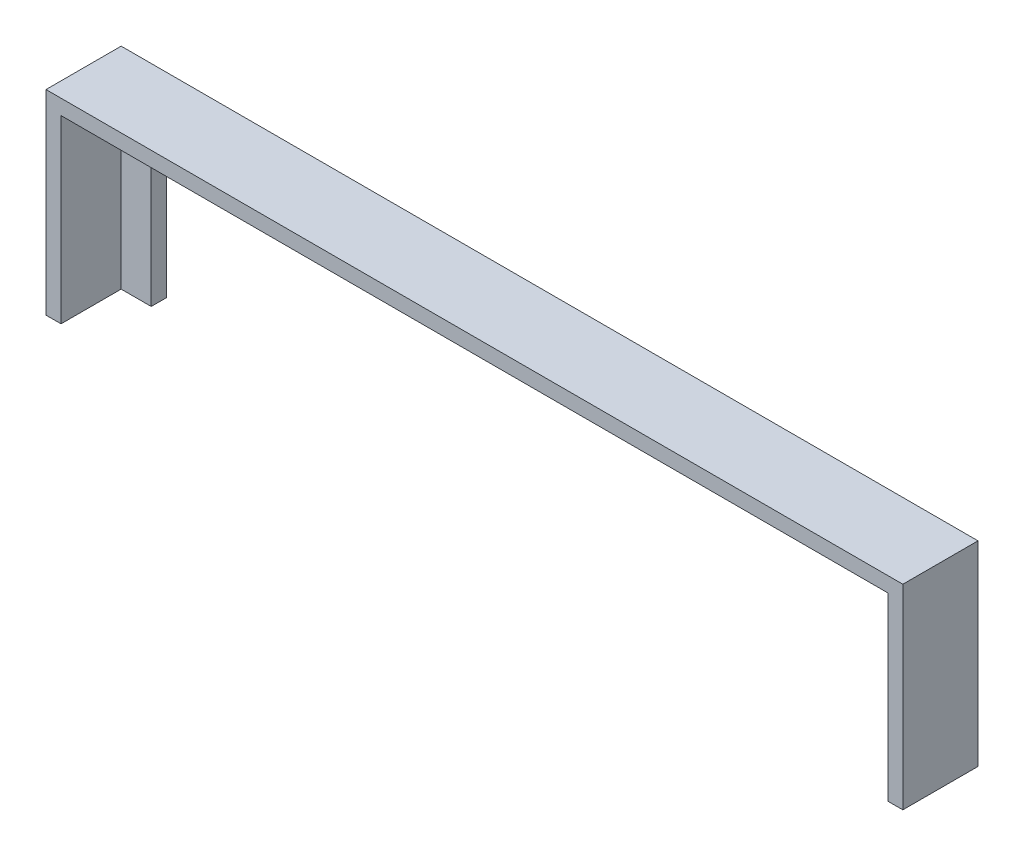
ISO-10303-21;
HEADER;
FILE_DESCRIPTION(('STEP AP214'),'2;1');
FILE_NAME('part.step','',(''),(''),'','','');
FILE_SCHEMA(('AUTOMOTIVE_DESIGN { 1 0 10303 214 1 1 1 1 }'));
ENDSEC;
DATA;
#1=APPLICATION_CONTEXT('core data for automotive mechanical design processes');
#2=APPLICATION_PROTOCOL_DEFINITION('international standard','automotive_design',2000,#1);
#3=PRODUCT_CONTEXT('',#1,'mechanical');
#4=PRODUCT('Part','Part','',(#3));
#5=PRODUCT_RELATED_PRODUCT_CATEGORY('part','',(#4));
#6=PRODUCT_DEFINITION_FORMATION('','',#4);
#7=PRODUCT_DEFINITION_CONTEXT('part definition',#1,'design');
#8=PRODUCT_DEFINITION('design','',#6,#7);
#9=PRODUCT_DEFINITION_SHAPE('','',#8);
#10=(LENGTH_UNIT() NAMED_UNIT(*) SI_UNIT(.MILLI.,.METRE.));
#11=(NAMED_UNIT(*) PLANE_ANGLE_UNIT() SI_UNIT($,.RADIAN.));
#12=(NAMED_UNIT(*) SI_UNIT($,.STERADIAN.) SOLID_ANGLE_UNIT());
#13=UNCERTAINTY_MEASURE_WITH_UNIT(LENGTH_MEASURE(1.E-05),#10,'distance_accuracy_value','');
#14=(GEOMETRIC_REPRESENTATION_CONTEXT(3) GLOBAL_UNCERTAINTY_ASSIGNED_CONTEXT((#13)) GLOBAL_UNIT_ASSIGNED_CONTEXT((#10,
#11,#12)) REPRESENTATION_CONTEXT('',''));
#15=CARTESIAN_POINT('',(0.,0.,0.));
#16=DIRECTION('',(0.,0.,1.));
#17=DIRECTION('',(1.,0.,0.));
#18=AXIS2_PLACEMENT_3D('',#15,#16,#17);
#19=CARTESIAN_POINT('',(-74.8414071478551,-5.70832886252337,5.));
#20=DIRECTION('',(0.,1.,0.));
#21=DIRECTION('',(0.,0.,1.));
#22=AXIS2_PLACEMENT_3D('',#19,#20,#21);
#23=PLANE('',#22);
#24=DIRECTION('',(1.,0.,0.));
#25=VECTOR('',#24,1.);
#26=CARTESIAN_POINT('',(-71.8414071478551,-5.70832886252337,1.));
#27=LINE('',#26,#25);
#28=CARTESIAN_POINT('',(-73.8414071478551,-5.70832886252337,1.));
#29=VERTEX_POINT('',#28);
#30=CARTESIAN_POINT('',(-71.8414071478551,-5.70832886252337,1.));
#31=VERTEX_POINT('',#30);
#32=EDGE_CURVE('E136',#29,#31,#27,.T.);
#33=ORIENTED_EDGE('',*,*,#32,.F.);
#34=DIRECTION('',(0.,0.,1.));
#35=VECTOR('',#34,1.);
#36=CARTESIAN_POINT('',(-73.8414071478551,-5.70832886252337,1.));
#37=LINE('',#36,#35);
#38=CARTESIAN_POINT('',(-73.8414071478551,-5.70832886252337,5.));
#39=VERTEX_POINT('',#38);
#40=EDGE_CURVE('E185',#29,#39,#37,.T.);
#41=ORIENTED_EDGE('',*,*,#40,.T.);
#42=DIRECTION('',(1.,0.,0.));
#43=VECTOR('',#42,1.);
#44=CARTESIAN_POINT('',(-74.8414071478551,-5.70832886252337,5.));
#45=LINE('',#44,#43);
#46=CARTESIAN_POINT('',(-74.8414071478551,-5.70832886252337,5.));
#47=VERTEX_POINT('',#46);
#48=EDGE_CURVE('E169',#47,#39,#45,.T.);
#49=ORIENTED_EDGE('',*,*,#48,.F.);
#50=DIRECTION('',(0.,0.,-1.));
#51=VECTOR('',#50,1.);
#52=CARTESIAN_POINT('',(-74.8414071478551,-5.70832886252337,5.));
#53=LINE('',#52,#51);
#54=CARTESIAN_POINT('',(-74.8414071478551,-5.70832886252337,0.));
#55=VERTEX_POINT('',#54);
#56=EDGE_CURVE('E166',#47,#55,#53,.T.);
#57=ORIENTED_EDGE('',*,*,#56,.T.);
#58=DIRECTION('',(1.,0.,0.));
#59=VECTOR('',#58,1.);
#60=CARTESIAN_POINT('',(-74.8414071478551,-5.70832886252337,0.));
#61=LINE('',#60,#59);
#62=CARTESIAN_POINT('',(-71.8414071478551,-5.70832886252337,0.));
#63=VERTEX_POINT('',#62);
#64=EDGE_CURVE('E182',#55,#63,#61,.T.);
#65=ORIENTED_EDGE('',*,*,#64,.T.);
#66=DIRECTION('',(0.,0.,-1.));
#67=VECTOR('',#66,1.);
#68=CARTESIAN_POINT('',(-71.8414071478551,-5.70832886252337,5.));
#69=LINE('',#68,#67);
#70=EDGE_CURVE('E11',#31,#63,#69,.T.);
#71=ORIENTED_EDGE('',*,*,#70,.F.);
#72=EDGE_LOOP('',(#33,#41,#49,#57,#65,#71));
#73=FACE_BOUND('',#72,.T.);
#74=ADVANCED_FACE('F33',(#73),#23,.F.);
#75=CARTESIAN_POINT('',(-71.8414071478551,-5.70832886252337,5.));
#76=DIRECTION('',(-1.,0.,0.));
#77=DIRECTION('',(0.,0.,1.));
#78=AXIS2_PLACEMENT_3D('',#75,#76,#77);
#79=PLANE('',#78);
#80=DIRECTION('',(0.,0.,-1.));
#81=VECTOR('',#80,1.);
#82=CARTESIAN_POINT('',(-71.8414071478551,4.29167113747663,5.));
#83=LINE('',#82,#81);
#84=CARTESIAN_POINT('',(-71.8414071478551,4.29167113747663,1.));
#85=VERTEX_POINT('',#84);
#86=CARTESIAN_POINT('',(-71.8414071478551,4.29167113747663,0.));
#87=VERTEX_POINT('',#86);
#88=EDGE_CURVE('E40',#85,#87,#83,.T.);
#89=ORIENTED_EDGE('',*,*,#88,.F.);
#90=DIRECTION('',(0.,1.,0.));
#91=VECTOR('',#90,1.);
#92=CARTESIAN_POINT('',(-71.8414071478551,4.29167113747663,1.));
#93=LINE('',#92,#91);
#94=EDGE_CURVE('E129',#31,#85,#93,.T.);
#95=ORIENTED_EDGE('',*,*,#94,.F.);
#96=ORIENTED_EDGE('',*,*,#70,.T.);
#97=DIRECTION('',(0.,1.,0.));
#98=VECTOR('',#97,1.);
#99=CARTESIAN_POINT('',(-71.8414071478551,-5.70832886252337,0.));
#100=LINE('',#99,#98);
#101=EDGE_CURVE('E152',#63,#87,#100,.T.);
#102=ORIENTED_EDGE('',*,*,#101,.T.);
#103=EDGE_LOOP('',(#89,#95,#96,#102));
#104=FACE_BOUND('',#103,.T.);
#105=ADVANCED_FACE('F150',(#104),#79,.F.);
#106=CARTESIAN_POINT('',(-71.8414071478551,4.29167113747663,5.));
#107=DIRECTION('',(0.,1.,0.));
#108=DIRECTION('',(0.,0.,1.));
#109=AXIS2_PLACEMENT_3D('',#106,#107,#108);
#110=PLANE('',#109);
#111=DIRECTION('',(0.,0.,-1.));
#112=VECTOR('',#111,1.);
#113=CARTESIAN_POINT('',(-20.8414071478551,4.29167113747663,5.));
#114=LINE('',#113,#112);
#115=CARTESIAN_POINT('',(-20.8414071478551,4.29167113747663,1.));
#116=VERTEX_POINT('',#115);
#117=CARTESIAN_POINT('',(-20.8414071478551,4.29167113747663,0.));
#118=VERTEX_POINT('',#117);
#119=EDGE_CURVE('E147',#116,#118,#114,.T.);
#120=ORIENTED_EDGE('',*,*,#119,.F.);
#121=DIRECTION('',(1.,0.,0.));
#122=VECTOR('',#121,1.);
#123=CARTESIAN_POINT('',(-20.8414071478551,4.29167113747663,1.));
#124=LINE('',#123,#122);
#125=EDGE_CURVE('E132',#85,#116,#124,.T.);
#126=ORIENTED_EDGE('',*,*,#125,.F.);
#127=ORIENTED_EDGE('',*,*,#88,.T.);
#128=DIRECTION('',(1.,0.,0.));
#129=VECTOR('',#128,1.);
#130=CARTESIAN_POINT('',(-71.8414071478551,4.29167113747663,0.));
#131=LINE('',#130,#129);
#132=EDGE_CURVE('E179',#87,#118,#131,.T.);
#133=ORIENTED_EDGE('',*,*,#132,.T.);
#134=EDGE_LOOP('',(#120,#126,#127,#133));
#135=FACE_BOUND('',#134,.T.);
#136=ADVANCED_FACE('F144',(#135),#110,.F.);
#137=CARTESIAN_POINT('',(-20.8414071478551,4.29167113747663,5.));
#138=DIRECTION('',(1.,0.,0.));
#139=DIRECTION('',(0.,0.,-1.));
#140=AXIS2_PLACEMENT_3D('',#137,#138,#139);
#141=PLANE('',#140);
#142=DIRECTION('',(0.,0.,-1.));
#143=VECTOR('',#142,1.);
#144=CARTESIAN_POINT('',(-20.8414071478551,-5.70832886252337,5.));
#145=LINE('',#144,#143);
#146=CARTESIAN_POINT('',(-20.8414071478551,-5.70832886252337,1.));
#147=VERTEX_POINT('',#146);
#148=CARTESIAN_POINT('',(-20.8414071478551,-5.70832886252337,0.));
#149=VERTEX_POINT('',#148);
#150=EDGE_CURVE('E154',#147,#149,#145,.T.);
#151=ORIENTED_EDGE('',*,*,#150,.F.);
#152=DIRECTION('',(0.,-1.,0.));
#153=VECTOR('',#152,1.);
#154=CARTESIAN_POINT('',(-20.8414071478551,-5.70832886252337,1.));
#155=LINE('',#154,#153);
#156=EDGE_CURVE('E148',#116,#147,#155,.T.);
#157=ORIENTED_EDGE('',*,*,#156,.F.);
#158=ORIENTED_EDGE('',*,*,#119,.T.);
#159=DIRECTION('',(0.,-1.,0.));
#160=VECTOR('',#159,1.);
#161=CARTESIAN_POINT('',(-20.8414071478551,4.29167113747663,0.));
#162=LINE('',#161,#160);
#163=EDGE_CURVE('E176',#118,#149,#162,.T.);
#164=ORIENTED_EDGE('',*,*,#163,.T.);
#165=EDGE_LOOP('',(#151,#157,#158,#164));
#166=FACE_BOUND('',#165,.T.);
#167=ADVANCED_FACE('F223',(#166),#141,.F.);
#168=CARTESIAN_POINT('',(-20.8414071478551,-5.70832886252337,5.));
#169=DIRECTION('',(0.,1.,0.));
#170=DIRECTION('',(0.,0.,1.));
#171=AXIS2_PLACEMENT_3D('',#168,#169,#170);
#172=PLANE('',#171);
#173=DIRECTION('',(1.,0.,0.));
#174=VECTOR('',#173,1.);
#175=CARTESIAN_POINT('',(-20.8414071478551,-5.70832886252337,5.));
#176=LINE('',#175,#174);
#177=CARTESIAN_POINT('',(-18.8414071478551,-5.70832886252337,5.));
#178=VERTEX_POINT('',#177);
#179=CARTESIAN_POINT('',(-17.8414071478551,-5.70832886252337,5.));
#180=VERTEX_POINT('',#179);
#181=EDGE_CURVE('E94',#178,#180,#176,.T.);
#182=ORIENTED_EDGE('',*,*,#181,.F.);
#183=DIRECTION('',(0.,0.,1.));
#184=VECTOR('',#183,1.);
#185=CARTESIAN_POINT('',(-18.8414071478551,-5.70832886252337,1.));
#186=LINE('',#185,#184);
#187=CARTESIAN_POINT('',(-18.8414071478551,-5.70832886252337,1.));
#188=VERTEX_POINT('',#187);
#189=EDGE_CURVE('E47',#188,#178,#186,.T.);
#190=ORIENTED_EDGE('',*,*,#189,.F.);
#191=DIRECTION('',(1.,0.,0.));
#192=VECTOR('',#191,1.);
#193=CARTESIAN_POINT('',(-18.8414071478551,-5.70832886252337,1.));
#194=LINE('',#193,#192);
#195=EDGE_CURVE('E215',#147,#188,#194,.T.);
#196=ORIENTED_EDGE('',*,*,#195,.F.);
#197=ORIENTED_EDGE('',*,*,#150,.T.);
#198=DIRECTION('',(1.,0.,0.));
#199=VECTOR('',#198,1.);
#200=CARTESIAN_POINT('',(-20.8414071478551,-5.70832886252337,0.));
#201=LINE('',#200,#199);
#202=CARTESIAN_POINT('',(-17.8414071478551,-5.70832886252337,0.));
#203=VERTEX_POINT('',#202);
#204=EDGE_CURVE('E174',#149,#203,#201,.T.);
#205=ORIENTED_EDGE('',*,*,#204,.T.);
#206=DIRECTION('',(0.,0.,-1.));
#207=VECTOR('',#206,1.);
#208=CARTESIAN_POINT('',(-17.8414071478551,-5.70832886252337,5.));
#209=LINE('',#208,#207);
#210=EDGE_CURVE('E158',#180,#203,#209,.T.);
#211=ORIENTED_EDGE('',*,*,#210,.F.);
#212=EDGE_LOOP('',(#182,#190,#196,#197,#205,#211));
#213=FACE_BOUND('',#212,.T.);
#214=ADVANCED_FACE('F222',(#213),#172,.F.);
#215=CARTESIAN_POINT('',(-17.8414071478551,-5.70832886252337,5.));
#216=DIRECTION('',(-1.,0.,0.));
#217=DIRECTION('',(0.,0.,1.));
#218=AXIS2_PLACEMENT_3D('',#215,#216,#217);
#219=PLANE('',#218);
#220=DIRECTION('',(0.,1.,0.));
#221=VECTOR('',#220,1.);
#222=CARTESIAN_POINT('',(-17.8414071478551,-5.70832886252337,0.));
#223=LINE('',#222,#221);
#224=CARTESIAN_POINT('',(-17.8414071478551,7.29167113747663,0.));
#225=VERTEX_POINT('',#224);
#226=EDGE_CURVE('E172',#203,#225,#223,.T.);
#227=ORIENTED_EDGE('',*,*,#226,.T.);
#228=DIRECTION('',(0.,0.,-1.));
#229=VECTOR('',#228,1.);
#230=CARTESIAN_POINT('',(-17.8414071478551,7.29167113747663,5.));
#231=LINE('',#230,#229);
#232=CARTESIAN_POINT('',(-17.8414071478551,7.29167113747663,5.));
#233=VERTEX_POINT('',#232);
#234=EDGE_CURVE('E161',#233,#225,#231,.T.);
#235=ORIENTED_EDGE('',*,*,#234,.F.);
#236=DIRECTION('',(0.,1.,0.));
#237=VECTOR('',#236,1.);
#238=CARTESIAN_POINT('',(-17.8414071478551,-5.70832886252337,5.));
#239=LINE('',#238,#237);
#240=EDGE_CURVE('E189',#180,#233,#239,.T.);
#241=ORIENTED_EDGE('',*,*,#240,.F.);
#242=ORIENTED_EDGE('',*,*,#210,.T.);
#243=EDGE_LOOP('',(#227,#235,#241,#242));
#244=FACE_BOUND('',#243,.T.);
#245=ADVANCED_FACE('F233',(#244),#219,.F.);
#246=CARTESIAN_POINT('',(-17.8414071478551,7.29167113747663,5.));
#247=DIRECTION('',(0.,-1.,0.));
#248=DIRECTION('',(1.,0.,0.));
#249=AXIS2_PLACEMENT_3D('',#246,#247,#248);
#250=PLANE('',#249);
#251=DIRECTION('',(-1.,0.,0.));
#252=VECTOR('',#251,1.);
#253=CARTESIAN_POINT('',(-17.8414071478551,7.29167113747663,0.));
#254=LINE('',#253,#252);
#255=CARTESIAN_POINT('',(-74.8414071478551,7.29167113747662,0.));
#256=VERTEX_POINT('',#255);
#257=EDGE_CURVE('E170',#225,#256,#254,.T.);
#258=ORIENTED_EDGE('',*,*,#257,.T.);
#259=DIRECTION('',(0.,0.,-1.));
#260=VECTOR('',#259,1.);
#261=CARTESIAN_POINT('',(-74.8414071478551,7.29167113747662,5.));
#262=LINE('',#261,#260);
#263=CARTESIAN_POINT('',(-74.8414071478551,7.29167113747662,5.));
#264=VERTEX_POINT('',#263);
#265=EDGE_CURVE('E164',#264,#256,#262,.T.);
#266=ORIENTED_EDGE('',*,*,#265,.F.);
#267=DIRECTION('',(-1.,0.,0.));
#268=VECTOR('',#267,1.);
#269=CARTESIAN_POINT('',(-17.8414071478551,7.29167113747663,5.));
#270=LINE('',#269,#268);
#271=EDGE_CURVE('E187',#233,#264,#270,.T.);
#272=ORIENTED_EDGE('',*,*,#271,.F.);
#273=ORIENTED_EDGE('',*,*,#234,.T.);
#274=EDGE_LOOP('',(#258,#266,#272,#273));
#275=FACE_BOUND('',#274,.T.);
#276=ADVANCED_FACE('F240',(#275),#250,.F.);
#277=CARTESIAN_POINT('',(-74.8414071478551,7.29167113747662,5.));
#278=DIRECTION('',(1.,0.,0.));
#279=DIRECTION('',(0.,0.,-1.));
#280=AXIS2_PLACEMENT_3D('',#277,#278,#279);
#281=PLANE('',#280);
#282=DIRECTION('',(0.,-1.,0.));
#283=VECTOR('',#282,1.);
#284=CARTESIAN_POINT('',(-74.8414071478551,7.29167113747662,0.));
#285=LINE('',#284,#283);
#286=EDGE_CURVE('E88',#256,#55,#285,.T.);
#287=ORIENTED_EDGE('',*,*,#286,.T.);
#288=ORIENTED_EDGE('',*,*,#56,.F.);
#289=DIRECTION('',(0.,-1.,0.));
#290=VECTOR('',#289,1.);
#291=CARTESIAN_POINT('',(-74.8414071478551,7.29167113747662,5.));
#292=LINE('',#291,#290);
#293=EDGE_CURVE('E56',#264,#47,#292,.T.);
#294=ORIENTED_EDGE('',*,*,#293,.F.);
#295=ORIENTED_EDGE('',*,*,#265,.T.);
#296=EDGE_LOOP('',(#287,#288,#294,#295));
#297=FACE_BOUND('',#296,.T.);
#298=ADVANCED_FACE('F241',(#297),#281,.F.);
#299=CARTESIAN_POINT('',(0.,0.,5.));
#300=DIRECTION('',(0.,0.,1.));
#301=DIRECTION('',(1.,0.,0.));
#302=AXIS2_PLACEMENT_3D('',#299,#300,#301);
#303=PLANE('',#302);
#304=DIRECTION('',(0.,-1.,0.));
#305=VECTOR('',#304,1.);
#306=CARTESIAN_POINT('',(-73.8414071478551,-5.70832886252337,5.));
#307=LINE('',#306,#305);
#308=CARTESIAN_POINT('',(-73.8414071478551,6.29167113747663,5.));
#309=VERTEX_POINT('',#308);
#310=EDGE_CURVE('E140',#309,#39,#307,.T.);
#311=ORIENTED_EDGE('',*,*,#310,.F.);
#312=DIRECTION('',(-1.,0.,0.));
#313=VECTOR('',#312,1.);
#314=CARTESIAN_POINT('',(-73.8414071478551,6.29167113747663,5.));
#315=LINE('',#314,#313);
#316=CARTESIAN_POINT('',(-18.8414071478551,6.29167113747663,5.));
#317=VERTEX_POINT('',#316);
#318=EDGE_CURVE('E201',#317,#309,#315,.T.);
#319=ORIENTED_EDGE('',*,*,#318,.F.);
#320=DIRECTION('',(0.,1.,0.));
#321=VECTOR('',#320,1.);
#322=CARTESIAN_POINT('',(-18.8414071478551,6.29167113747663,5.));
#323=LINE('',#322,#321);
#324=EDGE_CURVE('E204',#178,#317,#323,.T.);
#325=ORIENTED_EDGE('',*,*,#324,.F.);
#326=ORIENTED_EDGE('',*,*,#181,.T.);
#327=ORIENTED_EDGE('',*,*,#240,.T.);
#328=ORIENTED_EDGE('',*,*,#271,.T.);
#329=ORIENTED_EDGE('',*,*,#293,.T.);
#330=ORIENTED_EDGE('',*,*,#48,.T.);
#331=EDGE_LOOP('',(#311,#319,#325,#326,#327,#328,#329,#330));
#332=FACE_BOUND('',#331,.T.);
#333=ADVANCED_FACE('F237',(#332),#303,.T.);
#334=CARTESIAN_POINT('',(0.,0.,0.));
#335=DIRECTION('',(0.,0.,1.));
#336=DIRECTION('',(1.,0.,0.));
#337=AXIS2_PLACEMENT_3D('',#334,#335,#336);
#338=PLANE('',#337);
#339=ORIENTED_EDGE('',*,*,#64,.F.);
#340=ORIENTED_EDGE('',*,*,#286,.F.);
#341=ORIENTED_EDGE('',*,*,#257,.F.);
#342=ORIENTED_EDGE('',*,*,#226,.F.);
#343=ORIENTED_EDGE('',*,*,#204,.F.);
#344=ORIENTED_EDGE('',*,*,#163,.F.);
#345=ORIENTED_EDGE('',*,*,#132,.F.);
#346=ORIENTED_EDGE('',*,*,#101,.F.);
#347=EDGE_LOOP('',(#339,#340,#341,#342,#343,#344,#345,#346));
#348=FACE_BOUND('',#347,.T.);
#349=ADVANCED_FACE('F229',(#348),#338,.F.);
#350=CARTESIAN_POINT('',(-73.8414071478551,-5.70832886252337,1.));
#351=DIRECTION('',(-1.,0.,0.));
#352=DIRECTION('',(0.,0.,1.));
#353=AXIS2_PLACEMENT_3D('',#350,#351,#352);
#354=PLANE('',#353);
#355=ORIENTED_EDGE('',*,*,#310,.T.);
#356=ORIENTED_EDGE('',*,*,#40,.F.);
#357=DIRECTION('',(0.,-1.,0.));
#358=VECTOR('',#357,1.);
#359=CARTESIAN_POINT('',(-73.8414071478551,-5.70832886252337,1.));
#360=LINE('',#359,#358);
#361=CARTESIAN_POINT('',(-73.8414071478551,6.29167113747663,1.));
#362=VERTEX_POINT('',#361);
#363=EDGE_CURVE('E207',#362,#29,#360,.T.);
#364=ORIENTED_EDGE('',*,*,#363,.F.);
#365=DIRECTION('',(0.,0.,1.));
#366=VECTOR('',#365,1.);
#367=CARTESIAN_POINT('',(-73.8414071478551,6.29167113747663,1.));
#368=LINE('',#367,#366);
#369=EDGE_CURVE('E196',#362,#309,#368,.T.);
#370=ORIENTED_EDGE('',*,*,#369,.T.);
#371=EDGE_LOOP('',(#355,#356,#364,#370));
#372=FACE_BOUND('',#371,.T.);
#373=ADVANCED_FACE('F246',(#372),#354,.F.);
#374=CARTESIAN_POINT('',(-73.8414071478551,6.29167113747663,1.));
#375=DIRECTION('',(0.,1.,0.));
#376=DIRECTION('',(0.,0.,1.));
#377=AXIS2_PLACEMENT_3D('',#374,#375,#376);
#378=PLANE('',#377);
#379=ORIENTED_EDGE('',*,*,#318,.T.);
#380=ORIENTED_EDGE('',*,*,#369,.F.);
#381=DIRECTION('',(-1.,0.,0.));
#382=VECTOR('',#381,1.);
#383=CARTESIAN_POINT('',(-73.8414071478551,6.29167113747663,1.));
#384=LINE('',#383,#382);
#385=CARTESIAN_POINT('',(-18.8414071478551,6.29167113747663,1.));
#386=VERTEX_POINT('',#385);
#387=EDGE_CURVE('E209',#386,#362,#384,.T.);
#388=ORIENTED_EDGE('',*,*,#387,.F.);
#389=DIRECTION('',(0.,0.,1.));
#390=VECTOR('',#389,1.);
#391=CARTESIAN_POINT('',(-18.8414071478551,6.29167113747663,1.));
#392=LINE('',#391,#390);
#393=EDGE_CURVE('E194',#386,#317,#392,.T.);
#394=ORIENTED_EDGE('',*,*,#393,.T.);
#395=EDGE_LOOP('',(#379,#380,#388,#394));
#396=FACE_BOUND('',#395,.T.);
#397=ADVANCED_FACE('F250',(#396),#378,.F.);
#398=CARTESIAN_POINT('',(-18.8414071478551,6.29167113747663,1.));
#399=DIRECTION('',(1.,0.,0.));
#400=DIRECTION('',(0.,0.,-1.));
#401=AXIS2_PLACEMENT_3D('',#398,#399,#400);
#402=PLANE('',#401);
#403=ORIENTED_EDGE('',*,*,#324,.T.);
#404=ORIENTED_EDGE('',*,*,#393,.F.);
#405=DIRECTION('',(0.,1.,0.));
#406=VECTOR('',#405,1.);
#407=CARTESIAN_POINT('',(-18.8414071478551,6.29167113747663,1.));
#408=LINE('',#407,#406);
#409=EDGE_CURVE('E212',#188,#386,#408,.T.);
#410=ORIENTED_EDGE('',*,*,#409,.F.);
#411=ORIENTED_EDGE('',*,*,#189,.T.);
#412=EDGE_LOOP('',(#403,#404,#410,#411));
#413=FACE_BOUND('',#412,.T.);
#414=ADVANCED_FACE('F251',(#413),#402,.F.);
#415=CARTESIAN_POINT('',(0.,0.,1.));
#416=DIRECTION('',(0.,0.,-1.));
#417=DIRECTION('',(-1.,0.,0.));
#418=AXIS2_PLACEMENT_3D('',#415,#416,#417);
#419=PLANE('',#418);
#420=ORIENTED_EDGE('',*,*,#94,.T.);
#421=ORIENTED_EDGE('',*,*,#125,.T.);
#422=ORIENTED_EDGE('',*,*,#156,.T.);
#423=ORIENTED_EDGE('',*,*,#195,.T.);
#424=ORIENTED_EDGE('',*,*,#409,.T.);
#425=ORIENTED_EDGE('',*,*,#387,.T.);
#426=ORIENTED_EDGE('',*,*,#363,.T.);
#427=ORIENTED_EDGE('',*,*,#32,.T.);
#428=EDGE_LOOP('',(#420,#421,#422,#423,#424,#425,#426,#427));
#429=FACE_BOUND('',#428,.T.);
#430=ADVANCED_FACE('F131',(#429),#419,.F.);
#431=CLOSED_SHELL('',(#74,#105,#136,#167,#214,#245,#276,#298,#333,#349,#373,#397,#414,#430));
#432=MANIFOLD_SOLID_BREP('B2',#431);
#433=ADVANCED_BREP_SHAPE_REPRESENTATION('',(#18,#432),#14);
#434=SHAPE_DEFINITION_REPRESENTATION(#9,#433);
ENDSEC;
END-ISO-10303-21;
